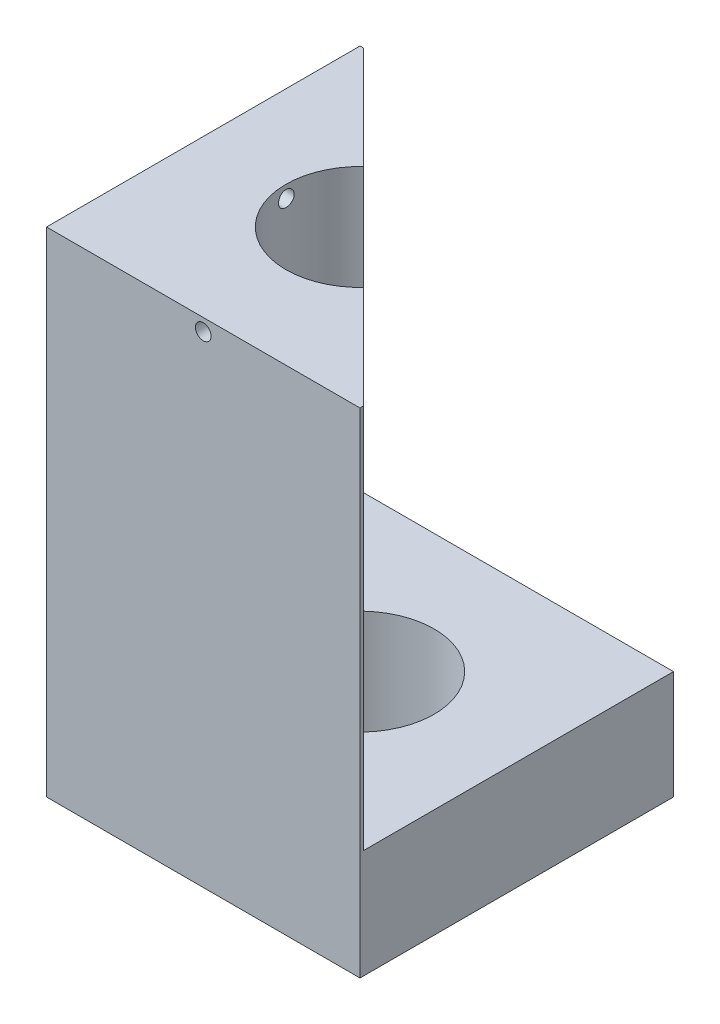
ISO-10303-21;
HEADER;
FILE_DESCRIPTION(('STEP AP214'),'2;1');
FILE_NAME('part.step','',(''),(''),'','','');
FILE_SCHEMA(('AUTOMOTIVE_DESIGN { 1 0 10303 214 1 1 1 1 }'));
ENDSEC;
DATA;
#1=APPLICATION_CONTEXT('core data for automotive mechanical design processes');
#2=APPLICATION_PROTOCOL_DEFINITION('international standard','automotive_design',2000,#1);
#3=PRODUCT_CONTEXT('',#1,'mechanical');
#4=PRODUCT('Part','Part','',(#3));
#5=PRODUCT_RELATED_PRODUCT_CATEGORY('part','',(#4));
#6=PRODUCT_DEFINITION_FORMATION('','',#4);
#7=PRODUCT_DEFINITION_CONTEXT('part definition',#1,'design');
#8=PRODUCT_DEFINITION('design','',#6,#7);
#9=PRODUCT_DEFINITION_SHAPE('','',#8);
#10=(LENGTH_UNIT() NAMED_UNIT(*) SI_UNIT(.MILLI.,.METRE.));
#11=(NAMED_UNIT(*) PLANE_ANGLE_UNIT() SI_UNIT($,.RADIAN.));
#12=(NAMED_UNIT(*) SI_UNIT($,.STERADIAN.) SOLID_ANGLE_UNIT());
#13=UNCERTAINTY_MEASURE_WITH_UNIT(LENGTH_MEASURE(1.E-05),#10,'distance_accuracy_value','');
#14=(GEOMETRIC_REPRESENTATION_CONTEXT(3) GLOBAL_UNCERTAINTY_ASSIGNED_CONTEXT((#13)) GLOBAL_UNIT_ASSIGNED_CONTEXT((#10,
#11,#12)) REPRESENTATION_CONTEXT('',''));
#15=CARTESIAN_POINT('',(0.,0.,0.));
#16=DIRECTION('',(0.,0.,1.));
#17=DIRECTION('',(1.,0.,0.));
#18=AXIS2_PLACEMENT_3D('',#15,#16,#17);
#19=CARTESIAN_POINT('',(0.,20.,0.));
#20=DIRECTION('',(1.,0.,0.));
#21=DIRECTION('',(0.,0.,-1.));
#22=AXIS2_PLACEMENT_3D('',#19,#20,#21);
#23=PLANE('',#22);
#24=CARTESIAN_POINT('',(0.,19.5,-6.35));
#25=DIRECTION('',(-1.,0.,0.));
#26=DIRECTION('',(0.,0.,1.));
#27=AXIS2_PLACEMENT_3D('',#24,#25,#26);
#28=CIRCLE('',#27,0.317499999999988);
#29=CARTESIAN_POINT('',(0.,19.5,-6.03250000000001));
#30=VERTEX_POINT('',#29);
#31=EDGE_CURVE('E185',#30,#30,#28,.T.);
#32=ORIENTED_EDGE('',*,*,#31,.F.);
#33=EDGE_LOOP('',(#32));
#34=FACE_BOUND('',#33,.T.);
#35=DIRECTION('',(0.,0.,1.));
#36=VECTOR('',#35,1.);
#37=CARTESIAN_POINT('',(0.,0.,0.));
#38=LINE('',#37,#36);
#39=CARTESIAN_POINT('',(0.,0.,-12.7));
#40=VERTEX_POINT('',#39);
#41=CARTESIAN_POINT('',(0.,0.,0.));
#42=VERTEX_POINT('',#41);
#43=EDGE_CURVE('E154',#40,#42,#38,.T.);
#44=ORIENTED_EDGE('',*,*,#43,.T.);
#45=DIRECTION('',(0.,-1.,0.));
#46=VECTOR('',#45,1.);
#47=CARTESIAN_POINT('',(0.,20.,0.));
#48=LINE('',#47,#46);
#49=CARTESIAN_POINT('',(0.,20.,0.));
#50=VERTEX_POINT('',#49);
#51=EDGE_CURVE('E130',#50,#42,#48,.T.);
#52=ORIENTED_EDGE('',*,*,#51,.F.);
#53=DIRECTION('',(0.,0.,1.));
#54=VECTOR('',#53,1.);
#55=CARTESIAN_POINT('',(0.,20.,0.));
#56=LINE('',#55,#54);
#57=CARTESIAN_POINT('',(0.,20.,-12.7));
#58=VERTEX_POINT('',#57);
#59=EDGE_CURVE('E159',#58,#50,#56,.T.);
#60=ORIENTED_EDGE('',*,*,#59,.F.);
#61=DIRECTION('',(0.,-1.,0.));
#62=VECTOR('',#61,1.);
#63=CARTESIAN_POINT('',(0.,20.,-12.7));
#64=LINE('',#63,#62);
#65=EDGE_CURVE('E128',#58,#40,#64,.T.);
#66=ORIENTED_EDGE('',*,*,#65,.T.);
#67=EDGE_LOOP('',(#44,#52,#60,#66));
#68=FACE_BOUND('',#67,.T.);
#69=ADVANCED_FACE('F33',(#34,#68),#23,.F.);
#70=CARTESIAN_POINT('',(0.,20.,0.));
#71=DIRECTION('',(0.,0.,-1.));
#72=DIRECTION('',(-1.,0.,0.));
#73=AXIS2_PLACEMENT_3D('',#70,#71,#72);
#74=PLANE('',#73);
#75=CARTESIAN_POINT('',(6.35,19.5,0.));
#76=DIRECTION('',(0.,0.,1.));
#77=DIRECTION('',(1.,0.,0.));
#78=AXIS2_PLACEMENT_3D('',#75,#76,#77);
#79=CIRCLE('',#78,0.317499999999988);
#80=CARTESIAN_POINT('',(6.66749999999999,19.5,0.));
#81=VERTEX_POINT('',#80);
#82=EDGE_CURVE('E193',#81,#81,#79,.T.);
#83=ORIENTED_EDGE('',*,*,#82,.F.);
#84=EDGE_LOOP('',(#83));
#85=FACE_BOUND('',#84,.T.);
#86=DIRECTION('',(1.,0.,0.));
#87=VECTOR('',#86,1.);
#88=CARTESIAN_POINT('',(0.,0.,0.));
#89=LINE('',#88,#87);
#90=CARTESIAN_POINT('',(12.7,0.,0.));
#91=VERTEX_POINT('',#90);
#92=EDGE_CURVE('E167',#42,#91,#89,.T.);
#93=ORIENTED_EDGE('',*,*,#92,.T.);
#94=DIRECTION('',(0.,-1.,0.));
#95=VECTOR('',#94,1.);
#96=CARTESIAN_POINT('',(12.7,20.,0.));
#97=LINE('',#96,#95);
#98=CARTESIAN_POINT('',(12.7,20.,0.));
#99=VERTEX_POINT('',#98);
#100=EDGE_CURVE('E127',#99,#91,#97,.T.);
#101=ORIENTED_EDGE('',*,*,#100,.F.);
#102=DIRECTION('',(1.,0.,0.));
#103=VECTOR('',#102,1.);
#104=CARTESIAN_POINT('',(0.,20.,0.));
#105=LINE('',#104,#103);
#106=EDGE_CURVE('E82',#50,#99,#105,.T.);
#107=ORIENTED_EDGE('',*,*,#106,.F.);
#108=ORIENTED_EDGE('',*,*,#51,.T.);
#109=EDGE_LOOP('',(#93,#101,#107,#108));
#110=FACE_BOUND('',#109,.T.);
#111=ADVANCED_FACE('F169',(#85,#110),#74,.F.);
#112=CARTESIAN_POINT('',(12.7,20.,0.));
#113=DIRECTION('',(-1.,0.,0.));
#114=DIRECTION('',(0.,0.,1.));
#115=AXIS2_PLACEMENT_3D('',#112,#113,#114);
#116=PLANE('',#115);
#117=DIRECTION('',(0.,0.,-1.));
#118=VECTOR('',#117,1.);
#119=CARTESIAN_POINT('',(12.7,4.4,-12.7));
#120=LINE('',#119,#118);
#121=CARTESIAN_POINT('',(12.7,4.4,-0.143684097937108));
#122=VERTEX_POINT('',#121);
#123=CARTESIAN_POINT('',(12.7,4.4,-12.7));
#124=VERTEX_POINT('',#123);
#125=EDGE_CURVE('E105',#122,#124,#120,.T.);
#126=ORIENTED_EDGE('',*,*,#125,.F.);
#127=DIRECTION('',(0.,1.,0.));
#128=VECTOR('',#127,1.);
#129=CARTESIAN_POINT('',(12.7,4.4,-0.143684097937108));
#130=LINE('',#129,#128);
#131=CARTESIAN_POINT('',(12.7,20.,-0.143684097937108));
#132=VERTEX_POINT('',#131);
#133=EDGE_CURVE('E151',#122,#132,#130,.T.);
#134=ORIENTED_EDGE('',*,*,#133,.T.);
#135=DIRECTION('',(0.,0.,-1.));
#136=VECTOR('',#135,1.);
#137=CARTESIAN_POINT('',(12.7,20.,0.));
#138=LINE('',#137,#136);
#139=EDGE_CURVE('E162',#99,#132,#138,.T.);
#140=ORIENTED_EDGE('',*,*,#139,.F.);
#141=ORIENTED_EDGE('',*,*,#100,.T.);
#142=DIRECTION('',(0.,0.,-1.));
#143=VECTOR('',#142,1.);
#144=CARTESIAN_POINT('',(12.7,0.,0.));
#145=LINE('',#144,#143);
#146=CARTESIAN_POINT('',(12.7,0.,-12.7));
#147=VERTEX_POINT('',#146);
#148=EDGE_CURVE('E126',#91,#147,#145,.T.);
#149=ORIENTED_EDGE('',*,*,#148,.T.);
#150=DIRECTION('',(0.,-1.,0.));
#151=VECTOR('',#150,1.);
#152=CARTESIAN_POINT('',(12.7,20.,-12.7));
#153=LINE('',#152,#151);
#154=EDGE_CURVE('E119',#124,#147,#153,.T.);
#155=ORIENTED_EDGE('',*,*,#154,.F.);
#156=EDGE_LOOP('',(#126,#134,#140,#141,#149,#155));
#157=FACE_BOUND('',#156,.T.);
#158=ADVANCED_FACE('F123',(#157),#116,.F.);
#159=CARTESIAN_POINT('',(0.,20.,-12.7));
#160=DIRECTION('',(0.,0.,1.));
#161=DIRECTION('',(1.,0.,0.));
#162=AXIS2_PLACEMENT_3D('',#159,#160,#161);
#163=PLANE('',#162);
#164=DIRECTION('',(-1.,0.,0.));
#165=VECTOR('',#164,1.);
#166=CARTESIAN_POINT('',(0.,20.,-12.7));
#167=LINE('',#166,#165);
#168=CARTESIAN_POINT('',(0.143684097937103,20.,-12.7));
#169=VERTEX_POINT('',#168);
#170=EDGE_CURVE('E56',#169,#58,#167,.T.);
#171=ORIENTED_EDGE('',*,*,#170,.F.);
#172=DIRECTION('',(0.,1.,0.));
#173=VECTOR('',#172,1.);
#174=CARTESIAN_POINT('',(0.143684097937103,4.4,-12.7));
#175=LINE('',#174,#173);
#176=CARTESIAN_POINT('',(0.143684097937103,4.4,-12.7));
#177=VERTEX_POINT('',#176);
#178=EDGE_CURVE('E121',#177,#169,#175,.T.);
#179=ORIENTED_EDGE('',*,*,#178,.F.);
#180=DIRECTION('',(-1.,0.,0.));
#181=VECTOR('',#180,1.);
#182=CARTESIAN_POINT('',(0.143684097937103,4.4,-12.7));
#183=LINE('',#182,#181);
#184=EDGE_CURVE('E108',#124,#177,#183,.T.);
#185=ORIENTED_EDGE('',*,*,#184,.F.);
#186=ORIENTED_EDGE('',*,*,#154,.T.);
#187=DIRECTION('',(-1.,0.,0.));
#188=VECTOR('',#187,1.);
#189=CARTESIAN_POINT('',(0.,0.,-12.7));
#190=LINE('',#189,#188);
#191=EDGE_CURVE('E76',#147,#40,#190,.T.);
#192=ORIENTED_EDGE('',*,*,#191,.T.);
#193=ORIENTED_EDGE('',*,*,#65,.F.);
#194=EDGE_LOOP('',(#171,#179,#185,#186,#192,#193));
#195=FACE_BOUND('',#194,.T.);
#196=ADVANCED_FACE('F118',(#195),#163,.F.);
#197=CARTESIAN_POINT('',(0.,20.,0.));
#198=DIRECTION('',(0.,-1.,0.));
#199=DIRECTION('',(0.,0.,-1.));
#200=AXIS2_PLACEMENT_3D('',#197,#198,#199);
#201=PLANE('',#200);
#202=ORIENTED_EDGE('',*,*,#139,.T.);
#203=DIRECTION('',(0.707106781186548,0.,0.707106781186547));
#204=VECTOR('',#203,1.);
#205=CARTESIAN_POINT('',(12.7,20.,-0.143684097937108));
#206=LINE('',#205,#204);
#207=CARTESIAN_POINT('',(8.5419455181417,20.,-4.30173857979541));
#208=VERTEX_POINT('',#207);
#209=EDGE_CURVE('E149',#208,#132,#206,.T.);
#210=ORIENTED_EDGE('',*,*,#209,.F.);
#211=CARTESIAN_POINT('',(6.35,20.,-6.35));
#212=DIRECTION('',(0.,1.,0.));
#213=DIRECTION('',(0.,0.,1.));
#214=AXIS2_PLACEMENT_3D('',#211,#212,#213);
#215=CIRCLE('',#214,3.);
#216=CARTESIAN_POINT('',(4.30173857979541,20.,-8.5419455181417));
#217=VERTEX_POINT('',#216);
#218=EDGE_CURVE('E144',#217,#208,#215,.T.);
#219=ORIENTED_EDGE('',*,*,#218,.F.);
#220=EDGE_CURVE('E115',#169,#217,#206,.T.);
#221=ORIENTED_EDGE('',*,*,#220,.F.);
#222=ORIENTED_EDGE('',*,*,#170,.T.);
#223=ORIENTED_EDGE('',*,*,#59,.T.);
#224=ORIENTED_EDGE('',*,*,#106,.T.);
#225=EDGE_LOOP('',(#202,#210,#219,#221,#222,#223,#224));
#226=FACE_BOUND('',#225,.T.);
#227=ADVANCED_FACE('F148',(#226),#201,.F.);
#228=CARTESIAN_POINT('',(0.,0.,0.));
#229=DIRECTION('',(0.,-1.,0.));
#230=DIRECTION('',(0.,0.,-1.));
#231=AXIS2_PLACEMENT_3D('',#228,#229,#230);
#232=PLANE('',#231);
#233=CARTESIAN_POINT('',(6.35,0.,-6.35));
#234=DIRECTION('',(0.,1.,0.));
#235=DIRECTION('',(0.,0.,1.));
#236=AXIS2_PLACEMENT_3D('',#233,#234,#235);
#237=CIRCLE('',#236,3.);
#238=CARTESIAN_POINT('',(6.35,0.,-3.35));
#239=VERTEX_POINT('',#238);
#240=EDGE_CURVE('E150',#239,#239,#237,.T.);
#241=ORIENTED_EDGE('',*,*,#240,.T.);
#242=EDGE_LOOP('',(#241));
#243=FACE_BOUND('',#242,.T.);
#244=ORIENTED_EDGE('',*,*,#43,.F.);
#245=ORIENTED_EDGE('',*,*,#191,.F.);
#246=ORIENTED_EDGE('',*,*,#148,.F.);
#247=ORIENTED_EDGE('',*,*,#92,.F.);
#248=EDGE_LOOP('',(#244,#245,#246,#247));
#249=FACE_BOUND('',#248,.T.);
#250=ADVANCED_FACE('F174',(#243,#249),#232,.T.);
#251=CARTESIAN_POINT('',(6.35,0.,-6.35));
#252=DIRECTION('',(0.,1.,0.));
#253=DIRECTION('',(0.,0.,1.));
#254=AXIS2_PLACEMENT_3D('',#251,#252,#253);
#255=CYLINDRICAL_SURFACE('',#254,3.);
#256=CARTESIAN_POINT('',(6.35,19.1825,-3.35));
#257=CARTESIAN_POINT('',(6.36778076549874,19.182500767122,-3.35000021525302));
#258=CARTESIAN_POINT('',(6.38557314933062,19.1839986790679,-3.35015975535455));
#259=CARTESIAN_POINT('',(6.42066425224102,19.1899513104743,-3.35078085033972));
#260=CARTESIAN_POINT('',(6.43796241206498,19.194409251191,-3.35124273424174));
#261=CARTESIAN_POINT('',(6.47155186128703,19.2061503685119,-3.35241640075573));
#262=CARTESIAN_POINT('',(6.48784376653719,19.2134317968067,-3.35312802869982));
#263=CARTESIAN_POINT('',(6.51897075289591,19.2306097059545,-3.35472170194468));
#264=CARTESIAN_POINT('',(6.53380611438688,19.240505682152,-3.35560371434931));
#265=CARTESIAN_POINT('',(6.56166179625648,19.2626742945689,-3.35744337648998));
#266=CARTESIAN_POINT('',(6.57467545407,19.2749552818903,-3.35840128478609));
#267=CARTESIAN_POINT('',(6.59846102675802,19.3015274569371,-3.36028265009303));
#268=CARTESIAN_POINT('',(6.60923283579024,19.3158187395193,-3.36120610547558));
#269=CARTESIAN_POINT('',(6.62825283067078,19.3460479138977,-3.36291662331786));
#270=CARTESIAN_POINT('',(6.63649493668433,19.3619896513936,-3.36370335524288));
#271=CARTESIAN_POINT('',(6.65018274093302,19.3950405920796,-3.36504808997625));
#272=CARTESIAN_POINT('',(6.6556285160717,19.4121497631486,-3.36560609907474));
#273=CARTESIAN_POINT('',(6.66354920112812,19.4469816489292,-3.3664278358835));
#274=CARTESIAN_POINT('',(6.6660352119626,19.4647018129459,-3.36669266294085));
#275=CARTESIAN_POINT('',(6.66800012234986,19.5003096911695,-3.36690145114449));
#276=CARTESIAN_POINT('',(6.66747910985262,19.5181974004607,-3.36684542167525));
#277=CARTESIAN_POINT('',(6.66345390458092,19.5535559019985,-3.36641983206132));
#278=CARTESIAN_POINT('',(6.65996185520681,19.571028094174,-3.36605154820265));
#279=CARTESIAN_POINT('',(6.65011260860329,19.605137023279,-3.36504493866534));
#280=CARTESIAN_POINT('',(6.64375536849802,19.6217737477021,-3.36440660894563));
#281=CARTESIAN_POINT('',(6.62834287061592,19.6537777104545,-3.36293036658729));
#282=CARTESIAN_POINT('',(6.61928224893395,19.6691423466145,-3.36209205783017));
#283=CARTESIAN_POINT('',(6.59872403612901,19.6981375039582,-3.36031064150787));
#284=CARTESIAN_POINT('',(6.58722636507745,19.7117679682422,-3.35936753050594));
#285=CARTESIAN_POINT('',(6.56205271839586,19.7369784108334,-3.35747708915484));
#286=CARTESIAN_POINT('',(6.54836625972144,19.7485479241395,-3.35652976098433));
#287=CARTESIAN_POINT('',(6.51923988141507,19.7692268579799,-3.35474201633448));
#288=CARTESIAN_POINT('',(6.50379995944098,19.7783362752282,-3.35390159999795));
#289=CARTESIAN_POINT('',(6.47159751140181,19.7938361053189,-3.35242204629903));
#290=CARTESIAN_POINT('',(6.45483471498518,19.8002259606586,-3.3517829502137));
#291=CARTESIAN_POINT('',(6.42046588841746,19.8100974769123,-3.3507784549774));
#292=CARTESIAN_POINT('',(6.40285988654174,19.8135792352719,-3.35041304665563));
#293=CARTESIAN_POINT('',(6.36739501544427,19.8175223857559,-3.34999827939228));
#294=CARTESIAN_POINT('',(6.34953776817338,19.8179982134348,-3.34994740994755));
#295=CARTESIAN_POINT('',(6.31399778442799,19.8159539488584,-3.35016339573588));
#296=CARTESIAN_POINT('',(6.29631504531155,19.8134339020291,-3.35043024615142));
#297=CARTESIAN_POINT('',(6.26166788973849,19.8054814030764,-3.3512507264877));
#298=CARTESIAN_POINT('',(6.24470189862644,19.8000557365681,-3.35180368813952));
#299=CARTESIAN_POINT('',(6.21192082726085,19.7864530037303,-3.35313438536423));
#300=CARTESIAN_POINT('',(6.19610577573547,19.778275868751,-3.35391212654534));
#301=CARTESIAN_POINT('',(6.16601041649538,19.7593667047748,-3.35560921661362));
#302=CARTESIAN_POINT('',(6.15173607802646,19.7486252226502,-3.35652908489933));
#303=CARTESIAN_POINT('',(6.12518783044083,19.7249057908794,-3.35840561713048));
#304=CARTESIAN_POINT('',(6.11291397770555,19.7119277782203,-3.35936228211206));
#305=CARTESIAN_POINT('',(6.09066475372995,19.6840405654175,-3.36120915580076));
#306=CARTESIAN_POINT('',(6.08069887725784,19.6691237685677,-3.36209908014493));
#307=CARTESIAN_POINT('',(6.06341384016366,19.6378197589222,-3.36370730653634));
#308=CARTESIAN_POINT('',(6.05609463962399,19.6214325683079,-3.36442561117192));
#309=CARTESIAN_POINT('',(6.04432650376397,19.5876850922611,-3.36560745475983));
#310=CARTESIAN_POINT('',(6.03987198260953,19.5703267727517,-3.36607148925003));
#311=CARTESIAN_POINT('',(6.03394155610633,19.5351033733447,-3.36669376454576));
#312=CARTESIAN_POINT('',(6.0324655541174,19.5172383099078,-3.36685201527267));
#313=CARTESIAN_POINT('',(6.03253549710316,19.4816029327048,-3.36684457849116));
#314=CARTESIAN_POINT('',(6.0340665272825,19.463832587457,-3.36668048977661));
#315=CARTESIAN_POINT('',(6.04007573547622,19.4288031133777,-3.36605027771581));
#316=CARTESIAN_POINT('',(6.04455391625415,19.4115439850255,-3.36558415408635));
#317=CARTESIAN_POINT('',(6.05632606965815,19.3780273840236,-3.36440284686504));
#318=CARTESIAN_POINT('',(6.06361954284807,19.3617697343033,-3.36368770745108));
#319=CARTESIAN_POINT('',(6.08081373276508,19.33070690926,-3.36208886056718));
#320=CARTESIAN_POINT('',(6.09071444511252,19.3159017314972,-3.3612051533804));
#321=CARTESIAN_POINT('',(6.11289797059444,19.2880876961805,-3.35936348856794));
#322=CARTESIAN_POINT('',(6.12519190573453,19.2750877309389,-3.35840519731611));
#323=CARTESIAN_POINT('',(6.15179050361142,19.2513289944464,-3.3565253696847));
#324=CARTESIAN_POINT('',(6.16609564551994,19.24057075881,-3.35560384213147));
#325=CARTESIAN_POINT('',(6.19635474624319,19.2215767845668,-3.35389866076451));
#326=CARTESIAN_POINT('',(6.21231318484078,19.2133481525525,-3.3531153979657));
#327=CARTESIAN_POINT('',(6.24538366430477,19.1996985407432,-3.3517791662905));
#328=CARTESIAN_POINT('',(6.26249439013712,19.1942744197085,-3.35122593989461));
#329=CARTESIAN_POINT('',(6.29141689917458,19.1877288366237,-3.35054992591872));
#330=CARTESIAN_POINT('',(6.30304428746952,19.1857707312492,-3.35034467443925));
#331=CARTESIAN_POINT('',(6.32644608459512,19.1831560619289,-3.35006964050101));
#332=CARTESIAN_POINT('',(6.33822049272621,19.1824994917925,-3.3499998573979));
#333=CARTESIAN_POINT('',(6.35,19.1825,-3.35));
#334=B_SPLINE_CURVE_WITH_KNOTS('',3,(#256,#257,#258,#259,#260,#261,#262,#263,#264,#265,#266,
#267,#268,#269,#270,#271,#272,#273,#274,#275,#276,#277,#278,#279,#280,#281,#282,#283,#284,#285,
#286,#287,#288,#289,#290,#291,#292,#293,#294,#295,#296,#297,#298,#299,#300,#301,#302,#303,#304,
#305,#306,#307,#308,#309,#310,#311,#312,#313,#314,#315,#316,#317,#318,#319,#320,#321,#322,#323,
#324,#325,#326,#327,#328,#329,#330,#331,#332,#333),.UNSPECIFIED.,.T.,.F.,(4,2,2,2,2,2,2,2,2,2,2,
2,2,2,2,2,2,2,2,2,2,2,2,2,2,2,2,2,2,2,2,2,2,2,2,2,2,2,4),(0.,0.0532992795540253,
0.106656657410378,0.159981048889925,0.213295155297766,0.266799420797317,0.320306211770049,
0.37394061064193,0.427573534403593,0.481004661928974,0.534434226698709,0.58764645429016,
0.640859478197138,0.694178794726583,0.747499860255324,0.801084404270611,0.854669019861425,
0.908264614867175,0.961858413898711,1.01519463943293,1.06853005624905,1.1217414563555,
1.17495418419576,1.22836618802828,1.28177969695799,1.33540918746808,1.38903786909555,
1.44256166060646,1.49608371547225,1.5493409727843,1.60259828003604,1.65584614371847,
1.70909391795547,1.76259532690739,1.81610950428464,1.86977267709631,1.92337561264592,
1.95868580430054,1.99399582800221),.UNSPECIFIED.);
#335=CARTESIAN_POINT('',(6.35,19.1825,-3.35));
#336=VERTEX_POINT('',#335);
#337=EDGE_CURVE('E188',#336,#336,#334,.T.);
#338=ORIENTED_EDGE('',*,*,#337,.T.);
#339=EDGE_LOOP('',(#338));
#340=FACE_BOUND('',#339,.T.);
#341=CARTESIAN_POINT('',(3.36684835283219,19.5,-6.03250000000001));
#342=CARTESIAN_POINT('',(3.36684813304408,19.5177804510849,-6.03250076740221));
#343=CARTESIAN_POINT('',(3.36668767393937,19.5355725214768,-6.03399862816352));
#344=CARTESIAN_POINT('',(3.36606329643411,19.5706629731589,-6.0399510377837));
#345=CARTESIAN_POINT('',(3.36559904731624,19.587960794948,-6.04440880899107));
#346=CARTESIAN_POINT('',(3.36442025121046,19.6215495293352,-6.05614943046055));
#347=CARTESIAN_POINT('',(3.36370585986058,19.6378410606474,-6.0634305243585));
#348=CARTESIAN_POINT('',(3.36210746376741,19.6689674202487,-6.08060764598312));
#349=CARTESIAN_POINT('',(3.36122349171363,19.6838025284559,-6.09050316987317));
#350=CARTESIAN_POINT('',(3.35938152079019,19.7116584955057,-6.11267132504431));
#351=CARTESIAN_POINT('',(3.35842326620999,19.7246726117531,-6.12495240851061));
#352=CARTESIAN_POINT('',(3.35654301726044,19.7484590694624,-6.15152496844353));
#353=CARTESIAN_POINT('',(3.35562102458194,19.7592313064884,-6.16581653851473));
#354=CARTESIAN_POINT('',(3.35391463335838,19.7782517495754,-6.19604596560314));
#355=CARTESIAN_POINT('',(3.35313056382716,19.7864939542265,-6.21198761887678));
#356=CARTESIAN_POINT('',(3.35179115201561,19.800181964057,-6.24503837653147));
#357=CARTESIAN_POINT('',(3.35123580354022,19.8056278449777,-6.2621474492776));
#358=CARTESIAN_POINT('',(3.3504182030348,19.8135487501113,-6.29697903071266));
#359=CARTESIAN_POINT('',(3.35015485513055,19.8160348848196,-6.3146989866781));
#360=CARTESIAN_POINT('',(3.34994719731617,19.818000115042,-6.3503064572959));
#361=CARTESIAN_POINT('',(3.35000287821781,19.8174792971583,-6.3681939671078));
#362=CARTESIAN_POINT('',(3.35042610960926,19.8134544006167,-6.40355332527533));
#363=CARTESIAN_POINT('',(3.35079241109232,19.8099622694331,-6.42102655063292));
#364=CARTESIAN_POINT('',(3.35179429433187,19.800112501322,-6.45513750384057));
#365=CARTESIAN_POINT('',(3.35242987994322,19.7937548233737,-6.47177521972635));
#366=CARTESIAN_POINT('',(3.35390103427224,19.7783414176555,-6.50378038671565));
#367=CARTESIAN_POINT('',(3.35473699238227,19.7692804279299,-6.51914528508316));
#368=CARTESIAN_POINT('',(3.35651514818408,19.7487214289366,-6.54814081087515));
#369=CARTESIAN_POINT('',(3.35745734936761,19.7372233395611,-6.56177138126834));
#370=CARTESIAN_POINT('',(3.35934776910587,19.7120493954088,-6.58698135362355));
#371=CARTESIAN_POINT('',(3.36029599451964,19.6983631431851,-6.5985503749816));
#372=CARTESIAN_POINT('',(3.3620869948783,19.6692373534854,-6.6192284145102));
#373=CARTESIAN_POINT('',(3.36292976963848,19.6537978129382,-6.62833742837157));
#374=CARTESIAN_POINT('',(3.36441450109733,19.6215954697795,-6.64383696798557));
#375=CARTESIAN_POINT('',(3.3650564074197,19.604832336539,-6.65022681193525));
#376=CARTESIAN_POINT('',(3.36606569321255,19.5704627776096,-6.660098202264));
#377=CARTESIAN_POINT('',(3.36643308207511,19.5528563807934,-6.6635798481419));
#378=CARTESIAN_POINT('',(3.36685008771473,19.5173913235241,-6.66752257418229));
#379=CARTESIAN_POINT('',(3.36690123420277,19.4995342968716,-6.66799819517852));
#380=CARTESIAN_POINT('',(3.36668400255014,19.463994803958,-6.66595359598064));
#381=CARTESIAN_POINT('',(3.3664156292556,19.4463123350536,-6.66343342122353));
#382=CARTESIAN_POINT('',(3.36559098935287,19.4116665360894,-6.65548095140782));
#383=CARTESIAN_POINT('',(3.36503540605447,19.3947016021003,-6.6500555671255));
#384=CARTESIAN_POINT('',(3.36369950032902,19.3619225201827,-6.63645375261845));
#385=CARTESIAN_POINT('',(3.36291917215769,19.3461084016811,-6.62827725207663));
#386=CARTESIAN_POINT('',(3.36121800476253,19.3160136823169,-6.6093690242506));
#387=CARTESIAN_POINT('',(3.36029664165228,19.3017391520766,-6.59862768271417));
#388=CARTESIAN_POINT('',(3.35841891769398,19.2751904521146,-6.57490841959596));
#389=CARTESIAN_POINT('',(3.3574625558752,19.2629163379279,-6.56193043594171));
#390=CARTESIAN_POINT('',(3.35561795651177,19.2406665430419,-6.53404310987242));
#391=CARTESIAN_POINT('',(3.35473001026216,19.2307003630012,-6.51912616542678));
#392=CARTESIAN_POINT('',(3.35312655358068,19.2134147933792,-6.48782177907596));
#393=CARTESIAN_POINT('',(3.35241104054148,19.2060953637761,-6.47143435941074));
#394=CARTESIAN_POINT('',(3.35123437942892,19.1943270777193,-6.43768702313767));
#395=CARTESIAN_POINT('',(3.35077272785756,19.1898725361703,-6.42032910729371));
#396=CARTESIAN_POINT('',(3.35015373365752,19.1839419321177,-6.3851065597073));
#397=CARTESIAN_POINT('',(3.34999638137611,19.1824657751363,-6.36724194405618));
#398=CARTESIAN_POINT('',(3.35000372856195,19.1825352634877,-6.33160630549395));
#399=CARTESIAN_POINT('',(3.35016685846631,19.1840661816502,-6.31383525171365));
#400=CARTESIAN_POINT('',(3.3507937400023,19.1900754149449,-6.27880433245489));
#401=CARTESIAN_POINT('',(3.35125749178852,19.1945537315927,-6.26154446723932));
#402=CARTESIAN_POINT('',(3.35243367929836,19.2063264375022,-6.22802638026404));
#403=CARTESIAN_POINT('',(3.35314607162402,19.2136203353532,-6.21176798428918));
#404=CARTESIAN_POINT('',(3.35474024257163,19.2308156058193,-6.18070384376711));
#405=CARTESIAN_POINT('',(3.35562202085507,19.2407169732235,-6.16589809631699));
#406=CARTESIAN_POINT('',(3.3574614191449,19.2629012222104,-6.13808408699022));
#407=CARTESIAN_POINT('',(3.3584193760577,19.275195075776,-6.12508459831317));
#408=CARTESIAN_POINT('',(3.36030034104252,19.3017933139997,-6.10132678525585));
#409=CARTESIAN_POINT('',(3.36122334069938,19.3160981789066,-6.09056899774304));
#410=CARTESIAN_POINT('',(3.3629326627507,19.3463570509089,-6.07157550930295));
#411=CARTESIAN_POINT('',(3.36371859301608,19.3623155877423,-6.06334699454415));
#412=CARTESIAN_POINT('',(3.36506014263463,19.3953862749416,-6.04969762911138));
#413=CARTESIAN_POINT('',(3.36561601964891,19.4124971096056,-6.04427363564797));
#414=CARTESIAN_POINT('',(3.36629544381514,19.4414192777993,-6.03772840960496));
#415=CARTESIAN_POINT('',(3.36650179320341,19.4530461912052,-6.03577046494652));
#416=CARTESIAN_POINT('',(3.36677832018316,19.4764470371037,-6.03315600911082));
#417=CARTESIAN_POINT('',(3.36684849843542,19.4882209688828,-6.03249949161839));
#418=CARTESIAN_POINT('',(3.36684835283219,19.5,-6.03250000000001));
#419=B_SPLINE_CURVE_WITH_KNOTS('',3,(#341,#342,#343,#344,#345,#346,#347,#348,#349,#350,#351,
#352,#353,#354,#355,#356,#357,#358,#359,#360,#361,#362,#363,#364,#365,#366,#367,#368,#369,#370,
#371,#372,#373,#374,#375,#376,#377,#378,#379,#380,#381,#382,#383,#384,#385,#386,#387,#388,#389,
#390,#391,#392,#393,#394,#395,#396,#397,#398,#399,#400,#401,#402,#403,#404,#405,#406,#407,#408,
#409,#410,#411,#412,#413,#414,#415,#416,#417,#418),.UNSPECIFIED.,.T.,.F.,(4,2,2,2,2,2,2,2,2,2,2,
2,2,2,2,2,2,2,2,2,2,2,2,2,2,2,2,2,2,2,2,2,2,2,2,2,2,2,4),(0.,0.0532983351007246,
0.106654789534413,0.159978104502344,0.213291150819796,0.266796652308775,0.320304645741102,
0.373938600076159,0.427571101606401,0.481001632533074,0.534430624633879,0.587645791705194,
0.6408617205868,0.694181916889383,0.747503866110023,0.801087156549841,0.854670540850758,
0.908267352710736,0.961862330775979,1.01519785791267,1.06853257612385,1.12174098415694,
1.17495075227217,1.22836319686721,1.28177712403106,1.33540716991516,1.38903640481702,
1.44255888657676,1.4960796705144,1.5493389895517,1.60259833597684,1.65584839110964,
1.70909833982717,1.76259850716891,1.81611147263564,1.86977510295114,1.92337846593351,
1.958687232347,1.99399582742425),.UNSPECIFIED.);
#420=CARTESIAN_POINT('',(3.36684835283219,19.5,-6.03250000000001));
#421=VERTEX_POINT('',#420);
#422=EDGE_CURVE('E187',#421,#421,#419,.T.);
#423=ORIENTED_EDGE('',*,*,#422,.T.);
#424=EDGE_LOOP('',(#423));
#425=FACE_BOUND('',#424,.T.);
#426=ORIENTED_EDGE('',*,*,#218,.T.);
#427=DIRECTION('',(0.,1.,0.));
#428=VECTOR('',#427,1.);
#429=CARTESIAN_POINT('',(8.5419455181417,0.,-4.30173857979541));
#430=LINE('',#429,#428);
#431=CARTESIAN_POINT('',(8.5419455181417,4.4,-4.30173857979541));
#432=VERTEX_POINT('',#431);
#433=EDGE_CURVE('E11',#208,#432,#430,.F.);
#434=ORIENTED_EDGE('',*,*,#433,.T.);
#435=CARTESIAN_POINT('',(6.35,4.4,-6.35));
#436=DIRECTION('',(0.,1.,0.));
#437=DIRECTION('',(0.,0.,1.));
#438=AXIS2_PLACEMENT_3D('',#435,#436,#437);
#439=CIRCLE('',#438,3.);
#440=CARTESIAN_POINT('',(4.30173857979541,4.4,-8.5419455181417));
#441=VERTEX_POINT('',#440);
#442=EDGE_CURVE('E136',#441,#432,#439,.F.);
#443=ORIENTED_EDGE('',*,*,#442,.F.);
#444=DIRECTION('',(0.,1.,0.));
#445=VECTOR('',#444,1.);
#446=CARTESIAN_POINT('',(4.30173857979541,0.,-8.5419455181417));
#447=LINE('',#446,#445);
#448=EDGE_CURVE('E40',#441,#217,#447,.T.);
#449=ORIENTED_EDGE('',*,*,#448,.T.);
#450=EDGE_LOOP('',(#426,#434,#443,#449));
#451=FACE_BOUND('',#450,.T.);
#452=ORIENTED_EDGE('',*,*,#240,.F.);
#453=EDGE_LOOP('',(#452));
#454=FACE_BOUND('',#453,.T.);
#455=ADVANCED_FACE('F142',(#340,#425,#451,#454),#255,.F.);
#456=CARTESIAN_POINT('',(12.7,4.4,-0.143684097937108));
#457=DIRECTION('',(-0.707106781186547,0.,0.707106781186548));
#458=DIRECTION('',(0.707106781186548,0.,0.707106781186547));
#459=AXIS2_PLACEMENT_3D('',#456,#457,#458);
#460=PLANE('',#459);
#461=ORIENTED_EDGE('',*,*,#209,.T.);
#462=ORIENTED_EDGE('',*,*,#133,.F.);
#463=DIRECTION('',(0.707106781186548,0.,0.707106781186547));
#464=VECTOR('',#463,1.);
#465=CARTESIAN_POINT('',(12.7,4.4,-0.143684097937108));
#466=LINE('',#465,#464);
#467=EDGE_CURVE('E110',#432,#122,#466,.T.);
#468=ORIENTED_EDGE('',*,*,#467,.F.);
#469=ORIENTED_EDGE('',*,*,#433,.F.);
#470=EDGE_LOOP('',(#461,#462,#468,#469));
#471=FACE_BOUND('',#470,.T.);
#472=ADVANCED_FACE('F224',(#471),#460,.F.);
#473=EDGE_CURVE('E47',#177,#441,#466,.T.);
#474=ORIENTED_EDGE('',*,*,#473,.F.);
#475=ORIENTED_EDGE('',*,*,#178,.T.);
#476=ORIENTED_EDGE('',*,*,#220,.T.);
#477=ORIENTED_EDGE('',*,*,#448,.F.);
#478=EDGE_LOOP('',(#474,#475,#476,#477));
#479=FACE_BOUND('',#478,.T.);
#480=ADVANCED_FACE('F231',(#479),#460,.F.);
#481=CARTESIAN_POINT('',(0.,4.4,0.));
#482=DIRECTION('',(0.,1.,0.));
#483=DIRECTION('',(0.,0.,1.));
#484=AXIS2_PLACEMENT_3D('',#481,#482,#483);
#485=PLANE('',#484);
#486=ORIENTED_EDGE('',*,*,#442,.T.);
#487=ORIENTED_EDGE('',*,*,#467,.T.);
#488=ORIENTED_EDGE('',*,*,#125,.T.);
#489=ORIENTED_EDGE('',*,*,#184,.T.);
#490=ORIENTED_EDGE('',*,*,#473,.T.);
#491=EDGE_LOOP('',(#486,#487,#488,#489,#490));
#492=FACE_BOUND('',#491,.T.);
#493=ADVANCED_FACE('F107',(#492),#485,.T.);
#494=CARTESIAN_POINT('',(0.,19.5,-6.35));
#495=DIRECTION('',(-1.,0.,0.));
#496=DIRECTION('',(0.,0.,1.));
#497=AXIS2_PLACEMENT_3D('',#494,#495,#496);
#498=CYLINDRICAL_SURFACE('',#497,0.317499999999993);
#499=ORIENTED_EDGE('',*,*,#422,.F.);
#500=EDGE_LOOP('',(#499));
#501=FACE_BOUND('',#500,.T.);
#502=ORIENTED_EDGE('',*,*,#31,.T.);
#503=EDGE_LOOP('',(#502));
#504=FACE_BOUND('',#503,.T.);
#505=ADVANCED_FACE('F206',(#501,#504),#498,.F.);
#506=CARTESIAN_POINT('',(6.35,19.5,0.));
#507=DIRECTION('',(0.,0.,1.));
#508=DIRECTION('',(1.,0.,0.));
#509=AXIS2_PLACEMENT_3D('',#506,#507,#508);
#510=CYLINDRICAL_SURFACE('',#509,0.317499999999993);
#511=ORIENTED_EDGE('',*,*,#337,.F.);
#512=EDGE_LOOP('',(#511));
#513=FACE_BOUND('',#512,.T.);
#514=ORIENTED_EDGE('',*,*,#82,.T.);
#515=EDGE_LOOP('',(#514));
#516=FACE_BOUND('',#515,.T.);
#517=ADVANCED_FACE('F209',(#513,#516),#510,.F.);
#518=CLOSED_SHELL('',(#69,#111,#158,#196,#227,#250,#455,#472,#480,#493,#505,#517));
#519=MANIFOLD_SOLID_BREP('B2',#518);
#520=ADVANCED_BREP_SHAPE_REPRESENTATION('',(#18,#519),#14);
#521=SHAPE_DEFINITION_REPRESENTATION(#9,#520);
ENDSEC;
END-ISO-10303-21;
